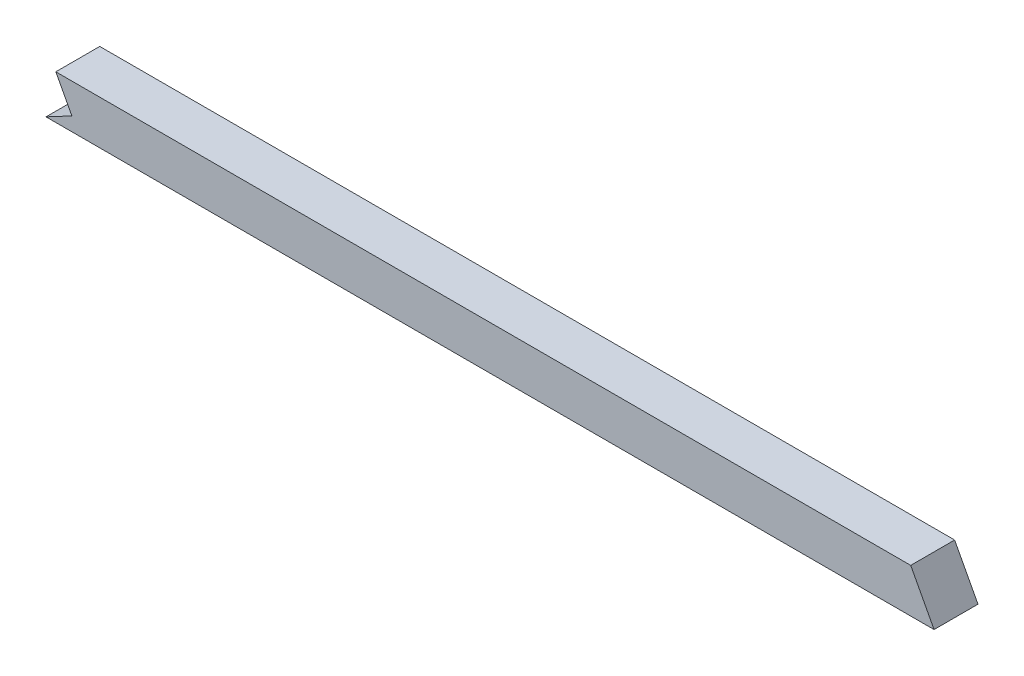
ISO-10303-21;
HEADER;
FILE_DESCRIPTION(('STEP AP214'),'2;1');
FILE_NAME('part.step','',(''),(''),'','','');
FILE_SCHEMA(('AUTOMOTIVE_DESIGN { 1 0 10303 214 1 1 1 1 }'));
ENDSEC;
DATA;
#1=APPLICATION_CONTEXT('core data for automotive mechanical design processes');
#2=APPLICATION_PROTOCOL_DEFINITION('international standard','automotive_design',2000,#1);
#3=PRODUCT_CONTEXT('',#1,'mechanical');
#4=PRODUCT('Part','Part','',(#3));
#5=PRODUCT_RELATED_PRODUCT_CATEGORY('part','',(#4));
#6=PRODUCT_DEFINITION_FORMATION('','',#4);
#7=PRODUCT_DEFINITION_CONTEXT('part definition',#1,'design');
#8=PRODUCT_DEFINITION('design','',#6,#7);
#9=PRODUCT_DEFINITION_SHAPE('','',#8);
#10=(LENGTH_UNIT() NAMED_UNIT(*) SI_UNIT(.MILLI.,.METRE.));
#11=(NAMED_UNIT(*) PLANE_ANGLE_UNIT() SI_UNIT($,.RADIAN.));
#12=(NAMED_UNIT(*) SI_UNIT($,.STERADIAN.) SOLID_ANGLE_UNIT());
#13=UNCERTAINTY_MEASURE_WITH_UNIT(LENGTH_MEASURE(1.E-05),#10,'distance_accuracy_value','');
#14=(GEOMETRIC_REPRESENTATION_CONTEXT(3) GLOBAL_UNCERTAINTY_ASSIGNED_CONTEXT((#13)) GLOBAL_UNIT_ASSIGNED_CONTEXT((#10,
#11,#12)) REPRESENTATION_CONTEXT('',''));
#15=CARTESIAN_POINT('',(0.,0.,0.));
#16=DIRECTION('',(0.,0.,1.));
#17=DIRECTION('',(1.,0.,0.));
#18=AXIS2_PLACEMENT_3D('',#15,#16,#17);
#19=CARTESIAN_POINT('',(770.128,19.05,-19.05));
#20=DIRECTION('',(0.,0.,1.));
#21=DIRECTION('',(0.,-1.,0.));
#22=AXIS2_PLACEMENT_3D('',#19,#20,#21);
#23=PLANE('',#22);
#24=DIRECTION('',(-1.,0.,0.));
#25=VECTOR('',#24,1.);
#26=CARTESIAN_POINT('',(770.128,-19.05,-19.05));
#27=LINE('',#26,#25);
#28=CARTESIAN_POINT('',(770.128,-19.05,-19.05));
#29=VERTEX_POINT('',#28);
#30=CARTESIAN_POINT('',(0.,-19.05,-19.05));
#31=VERTEX_POINT('',#30);
#32=EDGE_CURVE('E109',#29,#31,#27,.T.);
#33=ORIENTED_EDGE('',*,*,#32,.T.);
#34=DIRECTION('',(0.88294759285893,0.469471562785886,0.));
#35=VECTOR('',#34,1.);
#36=CARTESIAN_POINT('',(7.89658287858671,-14.851312405559,-19.05));
#37=LINE('',#36,#35);
#38=CARTESIAN_POINT('',(22.4268688586168,-7.1254223052385,-19.05));
#39=VERTEX_POINT('',#38);
#40=EDGE_CURVE('E89',#31,#39,#37,.T.);
#41=ORIENTED_EDGE('',*,*,#40,.T.);
#42=DIRECTION('',(-0.469471562785886,0.88294759285893,0.));
#43=VECTOR('',#42,1.);
#44=CARTESIAN_POINT('',(14.5302859800301,7.72589010032045,-19.05));
#45=LINE('',#44,#43);
#46=CARTESIAN_POINT('',(8.50914994119945,19.05,-19.05));
#47=VERTEX_POINT('',#46);
#48=EDGE_CURVE('E97',#39,#47,#45,.T.);
#49=ORIENTED_EDGE('',*,*,#48,.T.);
#50=DIRECTION('',(-1.,0.,0.));
#51=VECTOR('',#50,1.);
#52=CARTESIAN_POINT('',(770.128,19.05,-19.05));
#53=LINE('',#52,#51);
#54=CARTESIAN_POINT('',(749.869870653698,19.05,-19.05));
#55=VERTEX_POINT('',#54);
#56=EDGE_CURVE('E11',#55,#47,#53,.T.);
#57=ORIENTED_EDGE('',*,*,#56,.F.);
#58=DIRECTION('',(0.469471562785885,-0.88294759285893,0.));
#59=VECTOR('',#58,1.);
#60=CARTESIAN_POINT('',(770.128,-19.05,-19.05));
#61=LINE('',#60,#59);
#62=EDGE_CURVE('E122',#55,#29,#61,.T.);
#63=ORIENTED_EDGE('',*,*,#62,.T.);
#64=EDGE_LOOP('',(#33,#41,#49,#57,#63));
#65=FACE_BOUND('',#64,.T.);
#66=ADVANCED_FACE('F43',(#65),#23,.F.);
#67=CARTESIAN_POINT('',(770.128,19.05,19.05));
#68=DIRECTION('',(0.,-1.,0.));
#69=DIRECTION('',(0.,0.,-1.));
#70=AXIS2_PLACEMENT_3D('',#67,#68,#69);
#71=PLANE('',#70);
#72=ORIENTED_EDGE('',*,*,#56,.T.);
#73=DIRECTION('',(0.,0.,1.));
#74=VECTOR('',#73,1.);
#75=CARTESIAN_POINT('',(8.50914994119945,19.05,19.05));
#76=LINE('',#75,#74);
#77=CARTESIAN_POINT('',(8.50914994119947,19.0499999999999,19.05));
#78=VERTEX_POINT('',#77);
#79=EDGE_CURVE('E96',#47,#78,#76,.T.);
#80=ORIENTED_EDGE('',*,*,#79,.T.);
#81=DIRECTION('',(-1.,0.,0.));
#82=VECTOR('',#81,1.);
#83=CARTESIAN_POINT('',(770.128,19.05,19.05));
#84=LINE('',#83,#82);
#85=CARTESIAN_POINT('',(749.869870653698,19.05,19.05));
#86=VERTEX_POINT('',#85);
#87=EDGE_CURVE('E52',#86,#78,#84,.T.);
#88=ORIENTED_EDGE('',*,*,#87,.F.);
#89=DIRECTION('',(0.,0.,1.));
#90=VECTOR('',#89,1.);
#91=CARTESIAN_POINT('',(749.869870653698,19.05,-19.05));
#92=LINE('',#91,#90);
#93=EDGE_CURVE('E125',#55,#86,#92,.T.);
#94=ORIENTED_EDGE('',*,*,#93,.F.);
#95=EDGE_LOOP('',(#72,#80,#88,#94));
#96=FACE_BOUND('',#95,.T.);
#97=ADVANCED_FACE('F150',(#96),#71,.F.);
#98=CARTESIAN_POINT('',(770.128,19.05,19.05));
#99=DIRECTION('',(0.,0.,-1.));
#100=DIRECTION('',(0.,1.,0.));
#101=AXIS2_PLACEMENT_3D('',#98,#99,#100);
#102=PLANE('',#101);
#103=DIRECTION('',(-0.469471562785886,0.88294759285893,0.));
#104=VECTOR('',#103,1.);
#105=CARTESIAN_POINT('',(14.5302859800301,7.72589010032045,19.05));
#106=LINE('',#105,#104);
#107=CARTESIAN_POINT('',(22.4268688586168,-7.1254223052385,19.05));
#108=VERTEX_POINT('',#107);
#109=EDGE_CURVE('E111',#108,#78,#106,.T.);
#110=ORIENTED_EDGE('',*,*,#109,.F.);
#111=DIRECTION('',(0.88294759285893,0.469471562785886,0.));
#112=VECTOR('',#111,1.);
#113=CARTESIAN_POINT('',(7.89658287858671,-14.851312405559,19.05));
#114=LINE('',#113,#112);
#115=CARTESIAN_POINT('',(0.,-19.05,19.05));
#116=VERTEX_POINT('',#115);
#117=EDGE_CURVE('E92',#116,#108,#114,.T.);
#118=ORIENTED_EDGE('',*,*,#117,.F.);
#119=DIRECTION('',(-1.,0.,0.));
#120=VECTOR('',#119,1.);
#121=CARTESIAN_POINT('',(770.128,-19.05,19.05));
#122=LINE('',#121,#120);
#123=CARTESIAN_POINT('',(770.128,-19.05,19.05));
#124=VERTEX_POINT('',#123);
#125=EDGE_CURVE('E138',#124,#116,#122,.T.);
#126=ORIENTED_EDGE('',*,*,#125,.F.);
#127=DIRECTION('',(0.469471562785885,-0.88294759285893,0.));
#128=VECTOR('',#127,1.);
#129=CARTESIAN_POINT('',(770.128,-19.05,19.05));
#130=LINE('',#129,#128);
#131=EDGE_CURVE('E58',#86,#124,#130,.T.);
#132=ORIENTED_EDGE('',*,*,#131,.F.);
#133=ORIENTED_EDGE('',*,*,#87,.T.);
#134=EDGE_LOOP('',(#110,#118,#126,#132,#133));
#135=FACE_BOUND('',#134,.T.);
#136=ADVANCED_FACE('F147',(#135),#102,.F.);
#137=CARTESIAN_POINT('',(770.128,-19.05,19.05));
#138=DIRECTION('',(0.,1.,0.));
#139=DIRECTION('',(0.,0.,1.));
#140=AXIS2_PLACEMENT_3D('',#137,#138,#139);
#141=PLANE('',#140);
#142=DIRECTION('',(0.,0.,-1.));
#143=VECTOR('',#142,1.);
#144=CARTESIAN_POINT('',(0.,-19.05,19.05));
#145=LINE('',#144,#143);
#146=EDGE_CURVE('E130',#116,#31,#145,.T.);
#147=ORIENTED_EDGE('',*,*,#146,.T.);
#148=ORIENTED_EDGE('',*,*,#32,.F.);
#149=DIRECTION('',(0.,0.,-1.));
#150=VECTOR('',#149,1.);
#151=CARTESIAN_POINT('',(770.128,-19.05,19.05));
#152=LINE('',#151,#150);
#153=EDGE_CURVE('E131',#124,#29,#152,.T.);
#154=ORIENTED_EDGE('',*,*,#153,.F.);
#155=ORIENTED_EDGE('',*,*,#125,.T.);
#156=EDGE_LOOP('',(#147,#148,#154,#155));
#157=FACE_BOUND('',#156,.T.);
#158=ADVANCED_FACE('F153',(#157),#141,.F.);
#159=CARTESIAN_POINT('',(770.128,-19.05,-19.05));
#160=DIRECTION('',(-0.88294759285893,-0.469471562785885,0.));
#161=DIRECTION('',(0.469471562785885,-0.88294759285893,0.));
#162=AXIS2_PLACEMENT_3D('',#159,#160,#161);
#163=PLANE('',#162);
#164=ORIENTED_EDGE('',*,*,#131,.T.);
#165=ORIENTED_EDGE('',*,*,#153,.T.);
#166=ORIENTED_EDGE('',*,*,#62,.F.);
#167=ORIENTED_EDGE('',*,*,#93,.T.);
#168=EDGE_LOOP('',(#164,#165,#166,#167));
#169=FACE_BOUND('',#168,.T.);
#170=ADVANCED_FACE('F154',(#169),#163,.F.);
#171=CARTESIAN_POINT('',(14.5302859800301,7.72589010032045,-19.05));
#172=DIRECTION('',(0.88294759285893,0.469471562785886,0.));
#173=DIRECTION('',(-0.469471562785886,0.88294759285893,0.));
#174=AXIS2_PLACEMENT_3D('',#171,#172,#173);
#175=PLANE('',#174);
#176=ORIENTED_EDGE('',*,*,#48,.F.);
#177=DIRECTION('',(0.,0.,1.));
#178=VECTOR('',#177,1.);
#179=CARTESIAN_POINT('',(22.4268688586168,-7.1254223052385,-19.05));
#180=LINE('',#179,#178);
#181=EDGE_CURVE('E85',#39,#108,#180,.T.);
#182=ORIENTED_EDGE('',*,*,#181,.T.);
#183=ORIENTED_EDGE('',*,*,#109,.T.);
#184=ORIENTED_EDGE('',*,*,#79,.F.);
#185=EDGE_LOOP('',(#176,#182,#183,#184));
#186=FACE_BOUND('',#185,.T.);
#187=ADVANCED_FACE('F100',(#186),#175,.F.);
#188=CARTESIAN_POINT('',(7.89658287858671,-14.851312405559,-19.05));
#189=DIRECTION('',(0.469471562785886,-0.88294759285893,0.));
#190=DIRECTION('',(0.88294759285893,0.469471562785886,0.));
#191=AXIS2_PLACEMENT_3D('',#188,#189,#190);
#192=PLANE('',#191);
#193=ORIENTED_EDGE('',*,*,#117,.T.);
#194=ORIENTED_EDGE('',*,*,#181,.F.);
#195=ORIENTED_EDGE('',*,*,#40,.F.);
#196=ORIENTED_EDGE('',*,*,#146,.F.);
#197=EDGE_LOOP('',(#193,#194,#195,#196));
#198=FACE_BOUND('',#197,.T.);
#199=ADVANCED_FACE('F87',(#198),#192,.F.);
#200=CLOSED_SHELL('',(#66,#97,#136,#158,#170,#187,#199));
#201=MANIFOLD_SOLID_BREP('B2',#200);
#202=ADVANCED_BREP_SHAPE_REPRESENTATION('',(#18,#201),#14);
#203=SHAPE_DEFINITION_REPRESENTATION(#9,#202);
ENDSEC;
END-ISO-10303-21;
